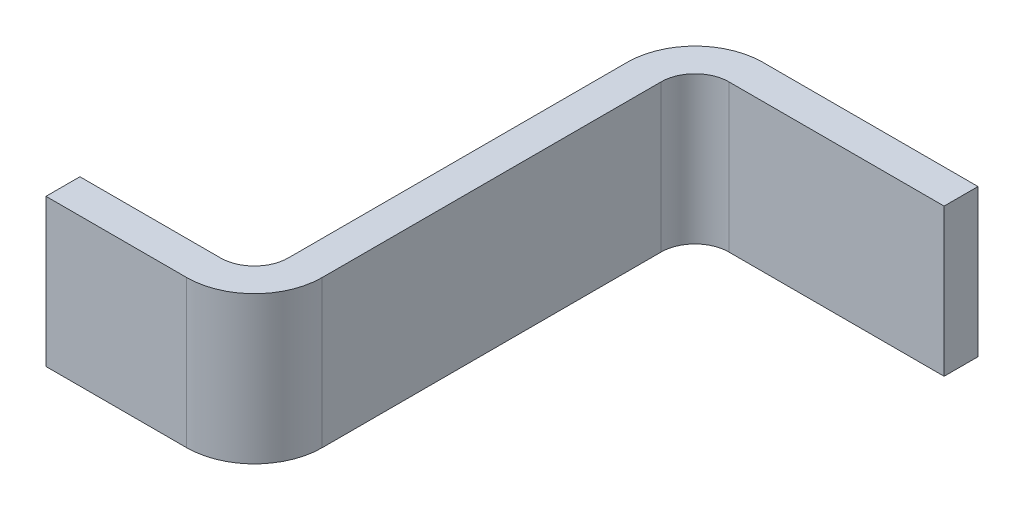
ISO-10303-21;
HEADER;
FILE_DESCRIPTION(('STEP AP214'),'2;1');
FILE_NAME('part.step','',(''),(''),'','','');
FILE_SCHEMA(('AUTOMOTIVE_DESIGN { 1 0 10303 214 1 1 1 1 }'));
ENDSEC;
DATA;
#1=APPLICATION_CONTEXT('core data for automotive mechanical design processes');
#2=APPLICATION_PROTOCOL_DEFINITION('international standard','automotive_design',2000,#1);
#3=PRODUCT_CONTEXT('',#1,'mechanical');
#4=PRODUCT('Part','Part','',(#3));
#5=PRODUCT_RELATED_PRODUCT_CATEGORY('part','',(#4));
#6=PRODUCT_DEFINITION_FORMATION('','',#4);
#7=PRODUCT_DEFINITION_CONTEXT('part definition',#1,'design');
#8=PRODUCT_DEFINITION('design','',#6,#7);
#9=PRODUCT_DEFINITION_SHAPE('','',#8);
#10=(LENGTH_UNIT() NAMED_UNIT(*) SI_UNIT(.MILLI.,.METRE.));
#11=(NAMED_UNIT(*) PLANE_ANGLE_UNIT() SI_UNIT($,.RADIAN.));
#12=(NAMED_UNIT(*) SI_UNIT($,.STERADIAN.) SOLID_ANGLE_UNIT());
#13=UNCERTAINTY_MEASURE_WITH_UNIT(LENGTH_MEASURE(1.E-05),#10,'distance_accuracy_value','');
#14=(GEOMETRIC_REPRESENTATION_CONTEXT(3) GLOBAL_UNCERTAINTY_ASSIGNED_CONTEXT((#13)) GLOBAL_UNIT_ASSIGNED_CONTEXT((#10,
#11,#12)) REPRESENTATION_CONTEXT('',''));
#15=CARTESIAN_POINT('',(0.,0.,0.));
#16=DIRECTION('',(0.,0.,1.));
#17=DIRECTION('',(1.,0.,0.));
#18=AXIS2_PLACEMENT_3D('',#15,#16,#17);
#19=CARTESIAN_POINT('',(0.,0.2175,1.4));
#20=DIRECTION('',(0.,0.,-1.));
#21=DIRECTION('',(-1.,0.,0.));
#22=AXIS2_PLACEMENT_3D('',#19,#20,#21);
#23=PLANE('',#22);
#24=DIRECTION('',(1.,0.,0.));
#25=VECTOR('',#24,1.);
#26=CARTESIAN_POINT('',(0.,0.2175,1.4));
#27=LINE('',#26,#25);
#28=CARTESIAN_POINT('',(0.415,0.2175,1.4));
#29=VERTEX_POINT('',#28);
#30=CARTESIAN_POINT('',(0.,0.2175,1.4));
#31=VERTEX_POINT('',#30);
#32=EDGE_CURVE('E85',#29,#31,#27,.F.);
#33=ORIENTED_EDGE('',*,*,#32,.T.);
#34=DIRECTION('',(0.,1.,0.));
#35=VECTOR('',#34,1.);
#36=CARTESIAN_POINT('',(0.,-0.2175,1.4));
#37=LINE('',#36,#35);
#38=CARTESIAN_POINT('',(0.,-0.2175,1.4));
#39=VERTEX_POINT('',#38);
#40=EDGE_CURVE('E111',#39,#31,#37,.T.);
#41=ORIENTED_EDGE('',*,*,#40,.F.);
#42=DIRECTION('',(1.,0.,0.));
#43=VECTOR('',#42,1.);
#44=CARTESIAN_POINT('',(0.,-0.2175,1.4));
#45=LINE('',#44,#43);
#46=CARTESIAN_POINT('',(0.415,-0.2175,1.4));
#47=VERTEX_POINT('',#46);
#48=EDGE_CURVE('E130',#39,#47,#45,.T.);
#49=ORIENTED_EDGE('',*,*,#48,.T.);
#50=DIRECTION('',(0.,1.,0.));
#51=VECTOR('',#50,1.);
#52=CARTESIAN_POINT('',(0.415,0.2175,1.4));
#53=LINE('',#52,#51);
#54=EDGE_CURVE('E121',#29,#47,#53,.F.);
#55=ORIENTED_EDGE('',*,*,#54,.F.);
#56=EDGE_LOOP('',(#33,#41,#49,#55));
#57=FACE_BOUND('',#56,.T.);
#58=ADVANCED_FACE('F17',(#57),#23,.F.);
#59=CARTESIAN_POINT('',(0.715,0.2175,0.1));
#60=DIRECTION('',(0.,0.,-1.));
#61=DIRECTION('',(-1.,0.,0.));
#62=AXIS2_PLACEMENT_3D('',#59,#60,#61);
#63=PLANE('',#62);
#64=DIRECTION('',(1.,0.,0.));
#65=VECTOR('',#64,1.);
#66=CARTESIAN_POINT('',(0.715,0.2175,0.1));
#67=LINE('',#66,#65);
#68=CARTESIAN_POINT('',(1.35,0.2175,0.1));
#69=VERTEX_POINT('',#68);
#70=CARTESIAN_POINT('',(0.715,0.2175,0.1));
#71=VERTEX_POINT('',#70);
#72=EDGE_CURVE('E142',#69,#71,#67,.F.);
#73=ORIENTED_EDGE('',*,*,#72,.T.);
#74=DIRECTION('',(0.,-1.,0.));
#75=VECTOR('',#74,1.);
#76=CARTESIAN_POINT('',(0.715,0.2175,0.1));
#77=LINE('',#76,#75);
#78=CARTESIAN_POINT('',(0.715,-0.2175,0.1));
#79=VERTEX_POINT('',#78);
#80=EDGE_CURVE('E189',#71,#79,#77,.T.);
#81=ORIENTED_EDGE('',*,*,#80,.T.);
#82=DIRECTION('',(1.,0.,0.));
#83=VECTOR('',#82,1.);
#84=CARTESIAN_POINT('',(0.715,-0.2175,0.1));
#85=LINE('',#84,#83);
#86=CARTESIAN_POINT('',(1.35,-0.2175,0.1));
#87=VERTEX_POINT('',#86);
#88=EDGE_CURVE('E193',#79,#87,#85,.T.);
#89=ORIENTED_EDGE('',*,*,#88,.T.);
#90=DIRECTION('',(0.,1.,0.));
#91=VECTOR('',#90,1.);
#92=CARTESIAN_POINT('',(1.35,-0.2175,0.1));
#93=LINE('',#92,#91);
#94=EDGE_CURVE('E96',#87,#69,#93,.T.);
#95=ORIENTED_EDGE('',*,*,#94,.T.);
#96=EDGE_LOOP('',(#73,#81,#89,#95));
#97=FACE_BOUND('',#96,.T.);
#98=ADVANCED_FACE('F230',(#97),#63,.F.);
#99=CARTESIAN_POINT('',(0.,-0.2175,1.3));
#100=DIRECTION('',(-1.,0.,0.));
#101=DIRECTION('',(0.,0.,1.));
#102=AXIS2_PLACEMENT_3D('',#99,#100,#101);
#103=PLANE('',#102);
#104=DIRECTION('',(0.,0.,1.));
#105=VECTOR('',#104,1.);
#106=CARTESIAN_POINT('',(0.,0.2175,1.3));
#107=LINE('',#106,#105);
#108=CARTESIAN_POINT('',(0.,0.2175,1.3));
#109=VERTEX_POINT('',#108);
#110=EDGE_CURVE('E114',#31,#109,#107,.F.);
#111=ORIENTED_EDGE('',*,*,#110,.T.);
#112=DIRECTION('',(0.,1.,0.));
#113=VECTOR('',#112,1.);
#114=CARTESIAN_POINT('',(0.,-0.2175,1.3));
#115=LINE('',#114,#113);
#116=CARTESIAN_POINT('',(0.,-0.2175,1.3));
#117=VERTEX_POINT('',#116);
#118=EDGE_CURVE('E175',#109,#117,#115,.F.);
#119=ORIENTED_EDGE('',*,*,#118,.T.);
#120=DIRECTION('',(0.,0.,1.));
#121=VECTOR('',#120,1.);
#122=CARTESIAN_POINT('',(0.,-0.2175,1.4));
#123=LINE('',#122,#121);
#124=EDGE_CURVE('E116',#117,#39,#123,.T.);
#125=ORIENTED_EDGE('',*,*,#124,.T.);
#126=ORIENTED_EDGE('',*,*,#40,.T.);
#127=EDGE_LOOP('',(#111,#119,#125,#126));
#128=FACE_BOUND('',#127,.T.);
#129=ADVANCED_FACE('F112',(#128),#103,.T.);
#130=CARTESIAN_POINT('',(0.415,0.2175,1.2));
#131=DIRECTION('',(0.,1.,0.));
#132=DIRECTION('',(0.,0.,1.));
#133=AXIS2_PLACEMENT_3D('',#130,#131,#132);
#134=CYLINDRICAL_SURFACE('',#133,0.2);
#135=CARTESIAN_POINT('',(0.415,0.2175,1.2));
#136=DIRECTION('',(0.,1.,0.));
#137=DIRECTION('',(0.,0.,1.));
#138=AXIS2_PLACEMENT_3D('',#135,#136,#137);
#139=CIRCLE('',#138,0.2);
#140=CARTESIAN_POINT('',(0.615,0.2175,1.2));
#141=VERTEX_POINT('',#140);
#142=EDGE_CURVE('E20',#29,#141,#139,.T.);
#143=ORIENTED_EDGE('',*,*,#142,.F.);
#144=ORIENTED_EDGE('',*,*,#54,.T.);
#145=CARTESIAN_POINT('',(0.415,-0.2175,1.2));
#146=DIRECTION('',(0.,1.,0.));
#147=DIRECTION('',(0.,0.,1.));
#148=AXIS2_PLACEMENT_3D('',#145,#146,#147);
#149=CIRCLE('',#148,0.2);
#150=CARTESIAN_POINT('',(0.615,-0.2175,1.2));
#151=VERTEX_POINT('',#150);
#152=EDGE_CURVE('E166',#151,#47,#149,.F.);
#153=ORIENTED_EDGE('',*,*,#152,.F.);
#154=DIRECTION('',(0.,1.,0.));
#155=VECTOR('',#154,1.);
#156=CARTESIAN_POINT('',(0.615,0.2175,1.2));
#157=LINE('',#156,#155);
#158=EDGE_CURVE('E168',#151,#141,#157,.T.);
#159=ORIENTED_EDGE('',*,*,#158,.T.);
#160=EDGE_LOOP('',(#143,#144,#153,#159));
#161=FACE_BOUND('',#160,.T.);
#162=ADVANCED_FACE('F220',(#161),#134,.T.);
#163=CARTESIAN_POINT('',(1.35,-0.2175,0.));
#164=DIRECTION('',(-1.,0.,0.));
#165=DIRECTION('',(0.,0.,1.));
#166=AXIS2_PLACEMENT_3D('',#163,#164,#165);
#167=PLANE('',#166);
#168=DIRECTION('',(0.,0.,1.));
#169=VECTOR('',#168,1.);
#170=CARTESIAN_POINT('',(1.35,0.2175,0.));
#171=LINE('',#170,#169);
#172=CARTESIAN_POINT('',(1.35,0.2175,0.));
#173=VERTEX_POINT('',#172);
#174=EDGE_CURVE('E141',#69,#173,#171,.F.);
#175=ORIENTED_EDGE('',*,*,#174,.F.);
#176=ORIENTED_EDGE('',*,*,#94,.F.);
#177=DIRECTION('',(0.,0.,1.));
#178=VECTOR('',#177,1.);
#179=CARTESIAN_POINT('',(1.35,-0.2175,0.1));
#180=LINE('',#179,#178);
#181=CARTESIAN_POINT('',(1.35,-0.2175,0.));
#182=VERTEX_POINT('',#181);
#183=EDGE_CURVE('E192',#87,#182,#180,.F.);
#184=ORIENTED_EDGE('',*,*,#183,.T.);
#185=DIRECTION('',(0.,1.,0.));
#186=VECTOR('',#185,1.);
#187=CARTESIAN_POINT('',(1.35,-0.2175,0.));
#188=LINE('',#187,#186);
#189=EDGE_CURVE('E161',#182,#173,#188,.T.);
#190=ORIENTED_EDGE('',*,*,#189,.T.);
#191=EDGE_LOOP('',(#175,#176,#184,#190));
#192=FACE_BOUND('',#191,.T.);
#193=ADVANCED_FACE('F232',(#192),#167,.F.);
#194=CARTESIAN_POINT('',(0.715,0.2175,0.2));
#195=DIRECTION('',(0.,-1.,0.));
#196=DIRECTION('',(0.,0.,-1.));
#197=AXIS2_PLACEMENT_3D('',#194,#195,#196);
#198=CYLINDRICAL_SURFACE('',#197,0.1);
#199=CARTESIAN_POINT('',(0.715,0.2175,0.2));
#200=DIRECTION('',(0.,-1.,0.));
#201=DIRECTION('',(0.,0.,-1.));
#202=AXIS2_PLACEMENT_3D('',#199,#200,#201);
#203=CIRCLE('',#202,0.1);
#204=CARTESIAN_POINT('',(0.615,0.2175,0.2));
#205=VERTEX_POINT('',#204);
#206=EDGE_CURVE('E162',#205,#71,#203,.T.);
#207=ORIENTED_EDGE('',*,*,#206,.F.);
#208=DIRECTION('',(0.,1.,0.));
#209=VECTOR('',#208,1.);
#210=CARTESIAN_POINT('',(0.615,0.2175,0.2));
#211=LINE('',#210,#209);
#212=CARTESIAN_POINT('',(0.615,-0.2175,0.2));
#213=VERTEX_POINT('',#212);
#214=EDGE_CURVE('E165',#205,#213,#211,.F.);
#215=ORIENTED_EDGE('',*,*,#214,.T.);
#216=CARTESIAN_POINT('',(0.715,-0.2175,0.2));
#217=DIRECTION('',(0.,-1.,0.));
#218=DIRECTION('',(0.,0.,-1.));
#219=AXIS2_PLACEMENT_3D('',#216,#217,#218);
#220=CIRCLE('',#219,0.1);
#221=EDGE_CURVE('E159',#79,#213,#220,.F.);
#222=ORIENTED_EDGE('',*,*,#221,.F.);
#223=ORIENTED_EDGE('',*,*,#80,.F.);
#224=EDGE_LOOP('',(#207,#215,#222,#223));
#225=FACE_BOUND('',#224,.T.);
#226=ADVANCED_FACE('F226',(#225),#198,.F.);
#227=CARTESIAN_POINT('',(0.,-0.2175,1.3));
#228=DIRECTION('',(0.,0.,1.));
#229=DIRECTION('',(1.,0.,0.));
#230=AXIS2_PLACEMENT_3D('',#227,#228,#229);
#231=PLANE('',#230);
#232=DIRECTION('',(1.,0.,0.));
#233=VECTOR('',#232,1.);
#234=CARTESIAN_POINT('',(0.,-0.2175,1.3));
#235=LINE('',#234,#233);
#236=CARTESIAN_POINT('',(0.415,-0.2175,1.3));
#237=VERTEX_POINT('',#236);
#238=EDGE_CURVE('E169',#117,#237,#235,.T.);
#239=ORIENTED_EDGE('',*,*,#238,.F.);
#240=ORIENTED_EDGE('',*,*,#118,.F.);
#241=DIRECTION('',(1.,0.,0.));
#242=VECTOR('',#241,1.);
#243=CARTESIAN_POINT('',(0.,0.2175,1.3));
#244=LINE('',#243,#242);
#245=CARTESIAN_POINT('',(0.415,0.2175,1.3));
#246=VERTEX_POINT('',#245);
#247=EDGE_CURVE('E128',#246,#109,#244,.F.);
#248=ORIENTED_EDGE('',*,*,#247,.F.);
#249=DIRECTION('',(0.,1.,0.));
#250=VECTOR('',#249,1.);
#251=CARTESIAN_POINT('',(0.415,-0.2175,1.3));
#252=LINE('',#251,#250);
#253=EDGE_CURVE('E155',#246,#237,#252,.F.);
#254=ORIENTED_EDGE('',*,*,#253,.T.);
#255=EDGE_LOOP('',(#239,#240,#248,#254));
#256=FACE_BOUND('',#255,.T.);
#257=ADVANCED_FACE('F266',(#256),#231,.F.);
#258=CARTESIAN_POINT('',(0.615,0.2175,1.2));
#259=DIRECTION('',(-1.,0.,0.));
#260=DIRECTION('',(0.,0.,1.));
#261=AXIS2_PLACEMENT_3D('',#258,#259,#260);
#262=PLANE('',#261);
#263=DIRECTION('',(0.,0.,-1.));
#264=VECTOR('',#263,1.);
#265=CARTESIAN_POINT('',(0.615,0.2175,1.2));
#266=LINE('',#265,#264);
#267=EDGE_CURVE('E158',#205,#141,#266,.F.);
#268=ORIENTED_EDGE('',*,*,#267,.T.);
#269=ORIENTED_EDGE('',*,*,#158,.F.);
#270=DIRECTION('',(0.,0.,1.));
#271=VECTOR('',#270,1.);
#272=CARTESIAN_POINT('',(0.615,-0.2175,1.2));
#273=LINE('',#272,#271);
#274=EDGE_CURVE('E152',#151,#213,#273,.F.);
#275=ORIENTED_EDGE('',*,*,#274,.T.);
#276=ORIENTED_EDGE('',*,*,#214,.F.);
#277=EDGE_LOOP('',(#268,#269,#275,#276));
#278=FACE_BOUND('',#277,.T.);
#279=ADVANCED_FACE('F268',(#278),#262,.F.);
#280=CARTESIAN_POINT('',(0.715,-0.2175,0.));
#281=DIRECTION('',(0.,0.,1.));
#282=DIRECTION('',(1.,0.,0.));
#283=AXIS2_PLACEMENT_3D('',#280,#281,#282);
#284=PLANE('',#283);
#285=DIRECTION('',(1.,0.,0.));
#286=VECTOR('',#285,1.);
#287=CARTESIAN_POINT('',(0.715,-0.2175,0.));
#288=LINE('',#287,#286);
#289=CARTESIAN_POINT('',(0.715,-0.2175,0.));
#290=VERTEX_POINT('',#289);
#291=EDGE_CURVE('E203',#290,#182,#288,.T.);
#292=ORIENTED_EDGE('',*,*,#291,.F.);
#293=DIRECTION('',(0.,-1.,0.));
#294=VECTOR('',#293,1.);
#295=CARTESIAN_POINT('',(0.715,-0.2175,0.));
#296=LINE('',#295,#294);
#297=CARTESIAN_POINT('',(0.715,0.2175,0.));
#298=VERTEX_POINT('',#297);
#299=EDGE_CURVE('E149',#298,#290,#296,.T.);
#300=ORIENTED_EDGE('',*,*,#299,.F.);
#301=DIRECTION('',(1.,0.,0.));
#302=VECTOR('',#301,1.);
#303=CARTESIAN_POINT('',(0.715,0.2175,0.));
#304=LINE('',#303,#302);
#305=EDGE_CURVE('E164',#173,#298,#304,.F.);
#306=ORIENTED_EDGE('',*,*,#305,.F.);
#307=ORIENTED_EDGE('',*,*,#189,.F.);
#308=EDGE_LOOP('',(#292,#300,#306,#307));
#309=FACE_BOUND('',#308,.T.);
#310=ADVANCED_FACE('F238',(#309),#284,.F.);
#311=CARTESIAN_POINT('',(0.515,0.2175,1.2));
#312=DIRECTION('',(0.,-1.,0.));
#313=DIRECTION('',(0.,0.,-1.));
#314=AXIS2_PLACEMENT_3D('',#311,#312,#313);
#315=PLANE('',#314);
#316=DIRECTION('',(0.,0.,-1.));
#317=VECTOR('',#316,1.);
#318=CARTESIAN_POINT('',(0.515,0.2175,1.2));
#319=LINE('',#318,#317);
#320=CARTESIAN_POINT('',(0.515,0.2175,0.2));
#321=VERTEX_POINT('',#320);
#322=CARTESIAN_POINT('',(0.515,0.2175,1.2));
#323=VERTEX_POINT('',#322);
#324=EDGE_CURVE('E148',#321,#323,#319,.F.);
#325=ORIENTED_EDGE('',*,*,#324,.T.);
#326=CARTESIAN_POINT('',(0.415,0.2175,1.2));
#327=DIRECTION('',(0.,1.,0.));
#328=DIRECTION('',(0.,0.,1.));
#329=AXIS2_PLACEMENT_3D('',#326,#327,#328);
#330=CIRCLE('',#329,0.1);
#331=EDGE_CURVE('E156',#323,#246,#330,.F.);
#332=ORIENTED_EDGE('',*,*,#331,.T.);
#333=ORIENTED_EDGE('',*,*,#247,.T.);
#334=ORIENTED_EDGE('',*,*,#110,.F.);
#335=ORIENTED_EDGE('',*,*,#32,.F.);
#336=ORIENTED_EDGE('',*,*,#142,.T.);
#337=ORIENTED_EDGE('',*,*,#267,.F.);
#338=ORIENTED_EDGE('',*,*,#206,.T.);
#339=ORIENTED_EDGE('',*,*,#72,.F.);
#340=ORIENTED_EDGE('',*,*,#174,.T.);
#341=ORIENTED_EDGE('',*,*,#305,.T.);
#342=CARTESIAN_POINT('',(0.715,0.2175,0.2));
#343=DIRECTION('',(0.,-1.,0.));
#344=DIRECTION('',(0.,0.,-1.));
#345=AXIS2_PLACEMENT_3D('',#342,#343,#344);
#346=CIRCLE('',#345,0.2);
#347=EDGE_CURVE('E150',#321,#298,#346,.T.);
#348=ORIENTED_EDGE('',*,*,#347,.F.);
#349=EDGE_LOOP('',(#325,#332,#333,#334,#335,#336,#337,#338,#339,#340,#341,#348));
#350=FACE_BOUND('',#349,.T.);
#351=ADVANCED_FACE('F126',(#350),#315,.F.);
#352=CARTESIAN_POINT('',(0.415,-0.2175,1.2));
#353=DIRECTION('',(0.,1.,0.));
#354=DIRECTION('',(0.,0.,1.));
#355=AXIS2_PLACEMENT_3D('',#352,#353,#354);
#356=CYLINDRICAL_SURFACE('',#355,0.1);
#357=CARTESIAN_POINT('',(0.415,-0.2175,1.2));
#358=DIRECTION('',(0.,1.,0.));
#359=DIRECTION('',(0.,0.,1.));
#360=AXIS2_PLACEMENT_3D('',#357,#358,#359);
#361=CIRCLE('',#360,0.1);
#362=CARTESIAN_POINT('',(0.515,-0.2175,1.2));
#363=VERTEX_POINT('',#362);
#364=EDGE_CURVE('E153',#237,#363,#361,.T.);
#365=ORIENTED_EDGE('',*,*,#364,.F.);
#366=ORIENTED_EDGE('',*,*,#253,.F.);
#367=ORIENTED_EDGE('',*,*,#331,.F.);
#368=DIRECTION('',(0.,1.,0.));
#369=VECTOR('',#368,1.);
#370=CARTESIAN_POINT('',(0.515,-0.2175,1.2));
#371=LINE('',#370,#369);
#372=EDGE_CURVE('E251',#323,#363,#371,.F.);
#373=ORIENTED_EDGE('',*,*,#372,.T.);
#374=EDGE_LOOP('',(#365,#366,#367,#373));
#375=FACE_BOUND('',#374,.T.);
#376=ADVANCED_FACE('F263',(#375),#356,.F.);
#377=CARTESIAN_POINT('',(0.615,-0.2175,1.2));
#378=DIRECTION('',(0.,1.,0.));
#379=DIRECTION('',(0.,0.,1.));
#380=AXIS2_PLACEMENT_3D('',#377,#378,#379);
#381=PLANE('',#380);
#382=ORIENTED_EDGE('',*,*,#274,.F.);
#383=ORIENTED_EDGE('',*,*,#152,.T.);
#384=ORIENTED_EDGE('',*,*,#48,.F.);
#385=ORIENTED_EDGE('',*,*,#124,.F.);
#386=ORIENTED_EDGE('',*,*,#238,.T.);
#387=ORIENTED_EDGE('',*,*,#364,.T.);
#388=DIRECTION('',(0.,0.,-1.));
#389=VECTOR('',#388,1.);
#390=CARTESIAN_POINT('',(0.515,-0.2175,1.2));
#391=LINE('',#390,#389);
#392=CARTESIAN_POINT('',(0.515,-0.2175,0.2));
#393=VERTEX_POINT('',#392);
#394=EDGE_CURVE('E26',#363,#393,#391,.T.);
#395=ORIENTED_EDGE('',*,*,#394,.T.);
#396=CARTESIAN_POINT('',(0.715,-0.2175,0.2));
#397=DIRECTION('',(0.,-1.,0.));
#398=DIRECTION('',(0.,0.,-1.));
#399=AXIS2_PLACEMENT_3D('',#396,#397,#398);
#400=CIRCLE('',#399,0.2);
#401=EDGE_CURVE('E34',#290,#393,#400,.F.);
#402=ORIENTED_EDGE('',*,*,#401,.F.);
#403=ORIENTED_EDGE('',*,*,#291,.T.);
#404=ORIENTED_EDGE('',*,*,#183,.F.);
#405=ORIENTED_EDGE('',*,*,#88,.F.);
#406=ORIENTED_EDGE('',*,*,#221,.T.);
#407=EDGE_LOOP('',(#382,#383,#384,#385,#386,#387,#395,#402,#403,#404,#405,#406));
#408=FACE_BOUND('',#407,.T.);
#409=ADVANCED_FACE('F240',(#408),#381,.F.);
#410=CARTESIAN_POINT('',(0.715,-0.2175,0.2));
#411=DIRECTION('',(0.,-1.,0.));
#412=DIRECTION('',(0.,0.,-1.));
#413=AXIS2_PLACEMENT_3D('',#410,#411,#412);
#414=CYLINDRICAL_SURFACE('',#413,0.2);
#415=ORIENTED_EDGE('',*,*,#401,.T.);
#416=DIRECTION('',(0.,1.,0.));
#417=VECTOR('',#416,1.);
#418=CARTESIAN_POINT('',(0.515,-0.2175,0.2));
#419=LINE('',#418,#417);
#420=EDGE_CURVE('E11',#393,#321,#419,.T.);
#421=ORIENTED_EDGE('',*,*,#420,.T.);
#422=ORIENTED_EDGE('',*,*,#347,.T.);
#423=ORIENTED_EDGE('',*,*,#299,.T.);
#424=EDGE_LOOP('',(#415,#421,#422,#423));
#425=FACE_BOUND('',#424,.T.);
#426=ADVANCED_FACE('F260',(#425),#414,.T.);
#427=CARTESIAN_POINT('',(0.515,-0.2175,1.2));
#428=DIRECTION('',(1.,0.,0.));
#429=DIRECTION('',(0.,0.,-1.));
#430=AXIS2_PLACEMENT_3D('',#427,#428,#429);
#431=PLANE('',#430);
#432=ORIENTED_EDGE('',*,*,#394,.F.);
#433=ORIENTED_EDGE('',*,*,#372,.F.);
#434=ORIENTED_EDGE('',*,*,#324,.F.);
#435=ORIENTED_EDGE('',*,*,#420,.F.);
#436=EDGE_LOOP('',(#432,#433,#434,#435));
#437=FACE_BOUND('',#436,.T.);
#438=ADVANCED_FACE('F258',(#437),#431,.F.);
#439=CLOSED_SHELL('',(#58,#98,#129,#162,#193,#226,#257,#279,#310,#351,#376,#409,#426,#438));
#440=MANIFOLD_SOLID_BREP('B1',#439);
#441=ADVANCED_BREP_SHAPE_REPRESENTATION('',(#18,#440),#14);
#442=SHAPE_DEFINITION_REPRESENTATION(#9,#441);
ENDSEC;
END-ISO-10303-21;
